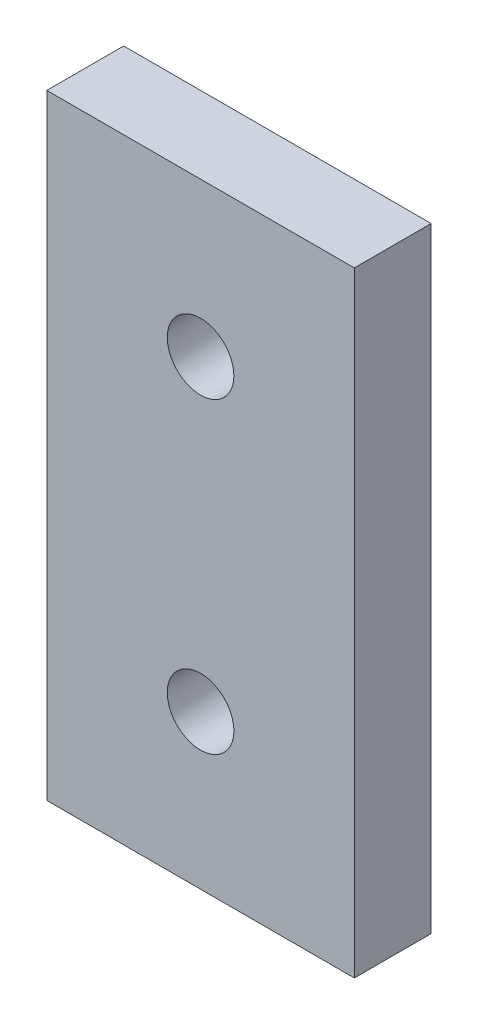
ISO-10303-21;
HEADER;
FILE_DESCRIPTION(('STEP AP214'),'2;1');
FILE_NAME('part.step','',(''),(''),'','','');
FILE_SCHEMA(('AUTOMOTIVE_DESIGN { 1 0 10303 214 1 1 1 1 }'));
ENDSEC;
DATA;
#1=APPLICATION_CONTEXT('core data for automotive mechanical design processes');
#2=APPLICATION_PROTOCOL_DEFINITION('international standard','automotive_design',2000,#1);
#3=PRODUCT_CONTEXT('',#1,'mechanical');
#4=PRODUCT('Part','Part','',(#3));
#5=PRODUCT_RELATED_PRODUCT_CATEGORY('part','',(#4));
#6=PRODUCT_DEFINITION_FORMATION('','',#4);
#7=PRODUCT_DEFINITION_CONTEXT('part definition',#1,'design');
#8=PRODUCT_DEFINITION('design','',#6,#7);
#9=PRODUCT_DEFINITION_SHAPE('','',#8);
#10=(LENGTH_UNIT() NAMED_UNIT(*) SI_UNIT(.MILLI.,.METRE.));
#11=(NAMED_UNIT(*) PLANE_ANGLE_UNIT() SI_UNIT($,.RADIAN.));
#12=(NAMED_UNIT(*) SI_UNIT($,.STERADIAN.) SOLID_ANGLE_UNIT());
#13=UNCERTAINTY_MEASURE_WITH_UNIT(LENGTH_MEASURE(1.E-05),#10,'distance_accuracy_value','');
#14=(GEOMETRIC_REPRESENTATION_CONTEXT(3) GLOBAL_UNCERTAINTY_ASSIGNED_CONTEXT((#13)) GLOBAL_UNIT_ASSIGNED_CONTEXT((#10,
#11,#12)) REPRESENTATION_CONTEXT('',''));
#15=CARTESIAN_POINT('',(0.,0.,0.));
#16=DIRECTION('',(0.,0.,1.));
#17=DIRECTION('',(1.,0.,0.));
#18=AXIS2_PLACEMENT_3D('',#15,#16,#17);
#19=CARTESIAN_POINT('',(12.7,25.4,6.35));
#20=DIRECTION('',(-1.,0.,0.));
#21=DIRECTION('',(0.,-1.,0.));
#22=AXIS2_PLACEMENT_3D('',#19,#20,#21);
#23=PLANE('',#22);
#24=DIRECTION('',(0.,1.,0.));
#25=VECTOR('',#24,1.);
#26=CARTESIAN_POINT('',(12.7,25.4,0.));
#27=LINE('',#26,#25);
#28=CARTESIAN_POINT('',(12.7,-25.4,0.));
#29=VERTEX_POINT('',#28);
#30=CARTESIAN_POINT('',(12.7,25.4,0.));
#31=VERTEX_POINT('',#30);
#32=EDGE_CURVE('E107',#29,#31,#27,.T.);
#33=ORIENTED_EDGE('',*,*,#32,.T.);
#34=DIRECTION('',(0.,0.,-1.));
#35=VECTOR('',#34,1.);
#36=CARTESIAN_POINT('',(12.7,25.4,6.35));
#37=LINE('',#36,#35);
#38=CARTESIAN_POINT('',(12.7,25.4,6.35));
#39=VERTEX_POINT('',#38);
#40=EDGE_CURVE('E11',#39,#31,#37,.T.);
#41=ORIENTED_EDGE('',*,*,#40,.F.);
#42=DIRECTION('',(0.,1.,0.));
#43=VECTOR('',#42,1.);
#44=CARTESIAN_POINT('',(12.7,25.4,6.35));
#45=LINE('',#44,#43);
#46=CARTESIAN_POINT('',(12.7,-25.4,6.35));
#47=VERTEX_POINT('',#46);
#48=EDGE_CURVE('E91',#47,#39,#45,.T.);
#49=ORIENTED_EDGE('',*,*,#48,.F.);
#50=DIRECTION('',(0.,0.,-1.));
#51=VECTOR('',#50,1.);
#52=CARTESIAN_POINT('',(12.7,-25.4,6.35));
#53=LINE('',#52,#51);
#54=EDGE_CURVE('E103',#47,#29,#53,.T.);
#55=ORIENTED_EDGE('',*,*,#54,.T.);
#56=EDGE_LOOP('',(#33,#41,#49,#55));
#57=FACE_BOUND('',#56,.T.);
#58=ADVANCED_FACE('F39',(#57),#23,.F.);
#59=CARTESIAN_POINT('',(-12.7,25.4,6.35));
#60=DIRECTION('',(0.,-1.,0.));
#61=DIRECTION('',(0.,0.,-1.));
#62=AXIS2_PLACEMENT_3D('',#59,#60,#61);
#63=PLANE('',#62);
#64=DIRECTION('',(-1.,0.,0.));
#65=VECTOR('',#64,1.);
#66=CARTESIAN_POINT('',(-12.7,25.4,0.));
#67=LINE('',#66,#65);
#68=CARTESIAN_POINT('',(-12.7,25.4,0.));
#69=VERTEX_POINT('',#68);
#70=EDGE_CURVE('E96',#31,#69,#67,.T.);
#71=ORIENTED_EDGE('',*,*,#70,.T.);
#72=DIRECTION('',(0.,0.,-1.));
#73=VECTOR('',#72,1.);
#74=CARTESIAN_POINT('',(-12.7,25.4,6.35));
#75=LINE('',#74,#73);
#76=CARTESIAN_POINT('',(-12.7,25.4,6.35));
#77=VERTEX_POINT('',#76);
#78=EDGE_CURVE('E48',#77,#69,#75,.T.);
#79=ORIENTED_EDGE('',*,*,#78,.F.);
#80=DIRECTION('',(-1.,0.,0.));
#81=VECTOR('',#80,1.);
#82=CARTESIAN_POINT('',(-12.7,25.4,6.35));
#83=LINE('',#82,#81);
#84=EDGE_CURVE('E86',#39,#77,#83,.T.);
#85=ORIENTED_EDGE('',*,*,#84,.F.);
#86=ORIENTED_EDGE('',*,*,#40,.T.);
#87=EDGE_LOOP('',(#71,#79,#85,#86));
#88=FACE_BOUND('',#87,.T.);
#89=ADVANCED_FACE('F95',(#88),#63,.F.);
#90=CARTESIAN_POINT('',(-12.7,25.4,6.35));
#91=DIRECTION('',(1.,0.,0.));
#92=DIRECTION('',(0.,1.,0.));
#93=AXIS2_PLACEMENT_3D('',#90,#91,#92);
#94=PLANE('',#93);
#95=DIRECTION('',(0.,-1.,0.));
#96=VECTOR('',#95,1.);
#97=CARTESIAN_POINT('',(-12.7,25.4,0.));
#98=LINE('',#97,#96);
#99=CARTESIAN_POINT('',(-12.7,-25.4,0.));
#100=VERTEX_POINT('',#99);
#101=EDGE_CURVE('E73',#69,#100,#98,.T.);
#102=ORIENTED_EDGE('',*,*,#101,.T.);
#103=DIRECTION('',(0.,0.,-1.));
#104=VECTOR('',#103,1.);
#105=CARTESIAN_POINT('',(-12.7,-25.4,6.35));
#106=LINE('',#105,#104);
#107=CARTESIAN_POINT('',(-12.7,-25.4,6.35));
#108=VERTEX_POINT('',#107);
#109=EDGE_CURVE('E98',#108,#100,#106,.T.);
#110=ORIENTED_EDGE('',*,*,#109,.F.);
#111=DIRECTION('',(0.,-1.,0.));
#112=VECTOR('',#111,1.);
#113=CARTESIAN_POINT('',(-12.7,25.4,6.35));
#114=LINE('',#113,#112);
#115=EDGE_CURVE('E89',#77,#108,#114,.T.);
#116=ORIENTED_EDGE('',*,*,#115,.F.);
#117=ORIENTED_EDGE('',*,*,#78,.T.);
#118=EDGE_LOOP('',(#102,#110,#116,#117));
#119=FACE_BOUND('',#118,.T.);
#120=ADVANCED_FACE('F99',(#119),#94,.F.);
#121=CARTESIAN_POINT('',(-12.7,-25.4,6.35));
#122=DIRECTION('',(0.,1.,0.));
#123=DIRECTION('',(0.,0.,1.));
#124=AXIS2_PLACEMENT_3D('',#121,#122,#123);
#125=PLANE('',#124);
#126=DIRECTION('',(1.,0.,0.));
#127=VECTOR('',#126,1.);
#128=CARTESIAN_POINT('',(-12.7,-25.4,0.));
#129=LINE('',#128,#127);
#130=EDGE_CURVE('E79',#100,#29,#129,.T.);
#131=ORIENTED_EDGE('',*,*,#130,.T.);
#132=ORIENTED_EDGE('',*,*,#54,.F.);
#133=DIRECTION('',(1.,0.,0.));
#134=VECTOR('',#133,1.);
#135=CARTESIAN_POINT('',(-12.7,-25.4,6.35));
#136=LINE('',#135,#134);
#137=EDGE_CURVE('E56',#108,#47,#136,.T.);
#138=ORIENTED_EDGE('',*,*,#137,.F.);
#139=ORIENTED_EDGE('',*,*,#109,.T.);
#140=EDGE_LOOP('',(#131,#132,#138,#139));
#141=FACE_BOUND('',#140,.T.);
#142=ADVANCED_FACE('F121',(#141),#125,.F.);
#143=CARTESIAN_POINT('',(0.,0.,6.35));
#144=DIRECTION('',(0.,0.,1.));
#145=DIRECTION('',(1.,0.,0.));
#146=AXIS2_PLACEMENT_3D('',#143,#144,#145);
#147=PLANE('',#146);
#148=CARTESIAN_POINT('',(0.,12.7,6.35));
#149=DIRECTION('',(0.,0.,1.));
#150=DIRECTION('',(1.,0.,0.));
#151=AXIS2_PLACEMENT_3D('',#148,#149,#150);
#152=CIRCLE('',#151,2.75);
#153=CARTESIAN_POINT('',(2.75,12.7,6.35));
#154=VERTEX_POINT('',#153);
#155=EDGE_CURVE('E136',#154,#154,#152,.T.);
#156=ORIENTED_EDGE('',*,*,#155,.F.);
#157=EDGE_LOOP('',(#156));
#158=FACE_BOUND('',#157,.T.);
#159=CARTESIAN_POINT('',(0.,-12.7,6.35));
#160=DIRECTION('',(0.,0.,1.));
#161=DIRECTION('',(-1.,0.,0.));
#162=AXIS2_PLACEMENT_3D('',#159,#160,#161);
#163=CIRCLE('',#162,2.75);
#164=CARTESIAN_POINT('',(-2.75,-12.7,6.35));
#165=VERTEX_POINT('',#164);
#166=EDGE_CURVE('E128',#165,#165,#163,.T.);
#167=ORIENTED_EDGE('',*,*,#166,.F.);
#168=EDGE_LOOP('',(#167));
#169=FACE_BOUND('',#168,.T.);
#170=ORIENTED_EDGE('',*,*,#48,.T.);
#171=ORIENTED_EDGE('',*,*,#84,.T.);
#172=ORIENTED_EDGE('',*,*,#115,.T.);
#173=ORIENTED_EDGE('',*,*,#137,.T.);
#174=EDGE_LOOP('',(#170,#171,#172,#173));
#175=FACE_BOUND('',#174,.T.);
#176=ADVANCED_FACE('F87',(#158,#169,#175),#147,.T.);
#177=CARTESIAN_POINT('',(0.,0.,0.));
#178=DIRECTION('',(0.,0.,1.));
#179=DIRECTION('',(1.,0.,0.));
#180=AXIS2_PLACEMENT_3D('',#177,#178,#179);
#181=PLANE('',#180);
#182=CARTESIAN_POINT('',(0.,12.7,0.));
#183=DIRECTION('',(0.,0.,1.));
#184=DIRECTION('',(1.,0.,0.));
#185=AXIS2_PLACEMENT_3D('',#182,#183,#184);
#186=CIRCLE('',#185,2.75);
#187=CARTESIAN_POINT('',(2.75,12.7,0.));
#188=VERTEX_POINT('',#187);
#189=EDGE_CURVE('E111',#188,#188,#186,.T.);
#190=ORIENTED_EDGE('',*,*,#189,.T.);
#191=EDGE_LOOP('',(#190));
#192=FACE_BOUND('',#191,.T.);
#193=CARTESIAN_POINT('',(0.,-12.7,0.));
#194=DIRECTION('',(0.,0.,1.));
#195=DIRECTION('',(-1.,0.,0.));
#196=AXIS2_PLACEMENT_3D('',#193,#194,#195);
#197=CIRCLE('',#196,2.75);
#198=CARTESIAN_POINT('',(-2.75,-12.7,0.));
#199=VERTEX_POINT('',#198);
#200=EDGE_CURVE('E132',#199,#199,#197,.T.);
#201=ORIENTED_EDGE('',*,*,#200,.T.);
#202=EDGE_LOOP('',(#201));
#203=FACE_BOUND('',#202,.T.);
#204=ORIENTED_EDGE('',*,*,#32,.F.);
#205=ORIENTED_EDGE('',*,*,#130,.F.);
#206=ORIENTED_EDGE('',*,*,#101,.F.);
#207=ORIENTED_EDGE('',*,*,#70,.F.);
#208=EDGE_LOOP('',(#204,#205,#206,#207));
#209=FACE_BOUND('',#208,.T.);
#210=ADVANCED_FACE('F124',(#192,#203,#209),#181,.F.);
#211=CARTESIAN_POINT('',(0.,-12.7,0.));
#212=DIRECTION('',(0.,0.,1.));
#213=DIRECTION('',(1.,0.,0.));
#214=AXIS2_PLACEMENT_3D('',#211,#212,#213);
#215=CYLINDRICAL_SURFACE('',#214,2.75);
#216=ORIENTED_EDGE('',*,*,#200,.F.);
#217=EDGE_LOOP('',(#216));
#218=FACE_BOUND('',#217,.T.);
#219=ORIENTED_EDGE('',*,*,#166,.T.);
#220=EDGE_LOOP('',(#219));
#221=FACE_BOUND('',#220,.T.);
#222=ADVANCED_FACE('F149',(#218,#221),#215,.F.);
#223=CARTESIAN_POINT('',(0.,12.7,0.));
#224=DIRECTION('',(0.,0.,1.));
#225=DIRECTION('',(1.,0.,0.));
#226=AXIS2_PLACEMENT_3D('',#223,#224,#225);
#227=CYLINDRICAL_SURFACE('',#226,2.75);
#228=ORIENTED_EDGE('',*,*,#189,.F.);
#229=EDGE_LOOP('',(#228));
#230=FACE_BOUND('',#229,.T.);
#231=ORIENTED_EDGE('',*,*,#155,.T.);
#232=EDGE_LOOP('',(#231));
#233=FACE_BOUND('',#232,.T.);
#234=ADVANCED_FACE('F146',(#230,#233),#227,.F.);
#235=CLOSED_SHELL('',(#58,#89,#120,#142,#176,#210,#222,#234));
#236=MANIFOLD_SOLID_BREP('B2',#235);
#237=ADVANCED_BREP_SHAPE_REPRESENTATION('',(#18,#236),#14);
#238=SHAPE_DEFINITION_REPRESENTATION(#9,#237);
ENDSEC;
END-ISO-10303-21;
